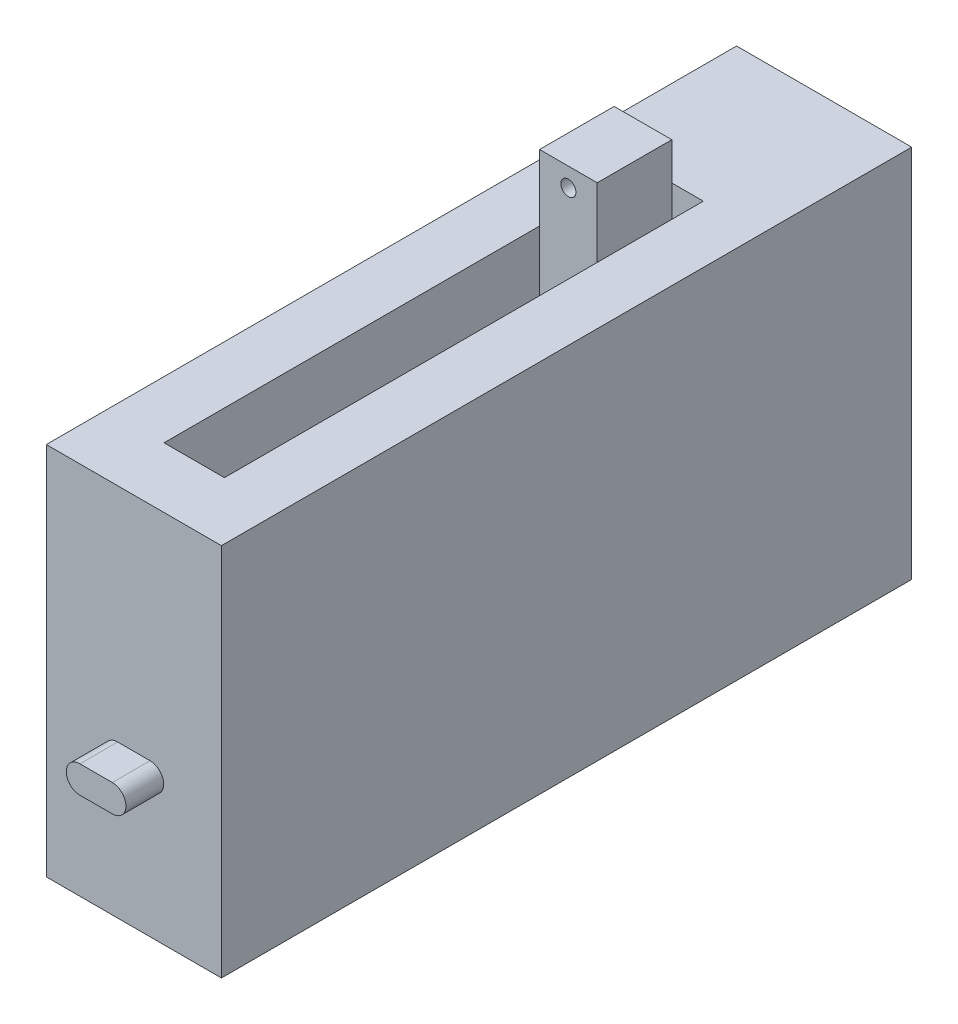
ISO-10303-21;
HEADER;
FILE_DESCRIPTION(('STEP AP214'),'2;1');
FILE_NAME('part.step','',(''),(''),'','','');
FILE_SCHEMA(('AUTOMOTIVE_DESIGN { 1 0 10303 214 1 1 1 1 }'));
ENDSEC;
DATA;
#1=APPLICATION_CONTEXT('core data for automotive mechanical design processes');
#2=APPLICATION_PROTOCOL_DEFINITION('international standard','automotive_design',2000,#1);
#3=PRODUCT_CONTEXT('',#1,'mechanical');
#4=PRODUCT('Part','Part','',(#3));
#5=PRODUCT_RELATED_PRODUCT_CATEGORY('part','',(#4));
#6=PRODUCT_DEFINITION_FORMATION('','',#4);
#7=PRODUCT_DEFINITION_CONTEXT('part definition',#1,'design');
#8=PRODUCT_DEFINITION('design','',#6,#7);
#9=PRODUCT_DEFINITION_SHAPE('','',#8);
#10=(LENGTH_UNIT() NAMED_UNIT(*) SI_UNIT(.MILLI.,.METRE.));
#11=(NAMED_UNIT(*) PLANE_ANGLE_UNIT() SI_UNIT($,.RADIAN.));
#12=(NAMED_UNIT(*) SI_UNIT($,.STERADIAN.) SOLID_ANGLE_UNIT());
#13=UNCERTAINTY_MEASURE_WITH_UNIT(LENGTH_MEASURE(1.E-05),#10,'distance_accuracy_value','');
#14=(GEOMETRIC_REPRESENTATION_CONTEXT(3) GLOBAL_UNCERTAINTY_ASSIGNED_CONTEXT((#13)) GLOBAL_UNIT_ASSIGNED_CONTEXT((#10,
#11,#12)) REPRESENTATION_CONTEXT('',''));
#15=CARTESIAN_POINT('',(0.,0.,0.));
#16=DIRECTION('',(0.,0.,1.));
#17=DIRECTION('',(1.,0.,0.));
#18=AXIS2_PLACEMENT_3D('',#15,#16,#17);
#19=CARTESIAN_POINT('',(-3.683,15.748,14.5161));
#20=DIRECTION('',(0.,0.,-1.));
#21=DIRECTION('',(-1.,0.,0.));
#22=AXIS2_PLACEMENT_3D('',#19,#20,#21);
#23=PLANE('',#22);
#24=DIRECTION('',(1.,0.,0.));
#25=VECTOR('',#24,1.);
#26=CARTESIAN_POINT('',(-3.683,0.,14.5161));
#27=LINE('',#26,#25);
#28=CARTESIAN_POINT('',(-3.683,0.,14.5161));
#29=VERTEX_POINT('',#28);
#30=CARTESIAN_POINT('',(3.683,0.,14.5161));
#31=VERTEX_POINT('',#30);
#32=EDGE_CURVE('E253',#29,#31,#27,.T.);
#33=ORIENTED_EDGE('',*,*,#32,.T.);
#34=DIRECTION('',(0.,-1.,0.));
#35=VECTOR('',#34,1.);
#36=CARTESIAN_POINT('',(3.683,15.748,14.5161));
#37=LINE('',#36,#35);
#38=CARTESIAN_POINT('',(3.683,15.748,14.5161));
#39=VERTEX_POINT('',#38);
#40=EDGE_CURVE('E259',#39,#31,#37,.T.);
#41=ORIENTED_EDGE('',*,*,#40,.F.);
#42=DIRECTION('',(1.,0.,0.));
#43=VECTOR('',#42,1.);
#44=CARTESIAN_POINT('',(-3.683,15.748,14.5161));
#45=LINE('',#44,#43);
#46=CARTESIAN_POINT('',(-3.683,15.748,14.5161));
#47=VERTEX_POINT('',#46);
#48=EDGE_CURVE('E257',#47,#39,#45,.T.);
#49=ORIENTED_EDGE('',*,*,#48,.F.);
#50=DIRECTION('',(0.,-1.,0.));
#51=VECTOR('',#50,1.);
#52=CARTESIAN_POINT('',(-3.683,15.748,14.5161));
#53=LINE('',#52,#51);
#54=EDGE_CURVE('E269',#47,#29,#53,.T.);
#55=ORIENTED_EDGE('',*,*,#54,.T.);
#56=EDGE_LOOP('',(#33,#41,#49,#55));
#57=FACE_BOUND('',#56,.T.);
#58=CARTESIAN_POINT('',(-0.682666256929174,5.842,14.5161));
#59=DIRECTION('',(0.,0.,1.));
#60=DIRECTION('',(1.,0.,0.));
#61=AXIS2_PLACEMENT_3D('',#58,#59,#60);
#62=CIRCLE('',#61,0.572003725186661);
#63=CARTESIAN_POINT('',(-0.682666256929174,6.41400372518666,14.5161));
#64=VERTEX_POINT('',#63);
#65=CARTESIAN_POINT('',(-0.682666256929174,5.26999627481334,14.5161));
#66=VERTEX_POINT('',#65);
#67=EDGE_CURVE('E171',#64,#66,#62,.T.);
#68=ORIENTED_EDGE('',*,*,#67,.F.);
#69=DIRECTION('',(-1.,0.,0.));
#70=VECTOR('',#69,1.);
#71=CARTESIAN_POINT('',(-0.682666256929174,6.41400372518666,14.5161));
#72=LINE('',#71,#70);
#73=CARTESIAN_POINT('',(0.682666256929174,6.41400372518666,14.5161));
#74=VERTEX_POINT('',#73);
#75=EDGE_CURVE('E168',#74,#64,#72,.T.);
#76=ORIENTED_EDGE('',*,*,#75,.F.);
#77=CARTESIAN_POINT('',(0.682666256929174,5.842,14.5161));
#78=DIRECTION('',(0.,0.,1.));
#79=DIRECTION('',(1.,0.,0.));
#80=AXIS2_PLACEMENT_3D('',#77,#78,#79);
#81=CIRCLE('',#80,0.572003725186661);
#82=CARTESIAN_POINT('',(0.682666256929174,5.26999627481334,14.5161));
#83=VERTEX_POINT('',#82);
#84=EDGE_CURVE('E58',#83,#74,#81,.T.);
#85=ORIENTED_EDGE('',*,*,#84,.F.);
#86=DIRECTION('',(1.,0.,0.));
#87=VECTOR('',#86,1.);
#88=CARTESIAN_POINT('',(-0.682666256929174,5.26999627481334,14.5161));
#89=LINE('',#88,#87);
#90=EDGE_CURVE('E53',#66,#83,#89,.T.);
#91=ORIENTED_EDGE('',*,*,#90,.F.);
#92=EDGE_LOOP('',(#68,#76,#85,#91));
#93=FACE_BOUND('',#92,.T.);
#94=ADVANCED_FACE('F37',(#57,#93),#23,.F.);
#95=CARTESIAN_POINT('',(0.,12.573,0.));
#96=DIRECTION('',(0.,-1.,0.));
#97=DIRECTION('',(0.,0.,-1.));
#98=AXIS2_PLACEMENT_3D('',#95,#96,#97);
#99=PLANE('',#98);
#100=DIRECTION('',(0.,0.,-1.));
#101=VECTOR('',#100,1.);
#102=CARTESIAN_POINT('',(1.27,12.573,11.9761));
#103=LINE('',#102,#101);
#104=CARTESIAN_POINT('',(1.27,12.573,11.9761));
#105=VERTEX_POINT('',#104);
#106=CARTESIAN_POINT('',(1.27,12.573,-8.1661));
#107=VERTEX_POINT('',#106);
#108=EDGE_CURVE('E217',#105,#107,#103,.T.);
#109=ORIENTED_EDGE('',*,*,#108,.T.);
#110=DIRECTION('',(-1.,0.,0.));
#111=VECTOR('',#110,1.);
#112=CARTESIAN_POINT('',(-1.27,12.573,-8.1661));
#113=LINE('',#112,#111);
#114=CARTESIAN_POINT('',(-1.27,12.573,-8.1661));
#115=VERTEX_POINT('',#114);
#116=EDGE_CURVE('E220',#107,#115,#113,.T.);
#117=ORIENTED_EDGE('',*,*,#116,.T.);
#118=DIRECTION('',(0.,0.,1.));
#119=VECTOR('',#118,1.);
#120=CARTESIAN_POINT('',(-1.27,12.573,11.9761));
#121=LINE('',#120,#119);
#122=CARTESIAN_POINT('',(-1.27,12.573,11.9761));
#123=VERTEX_POINT('',#122);
#124=EDGE_CURVE('E224',#115,#123,#121,.T.);
#125=ORIENTED_EDGE('',*,*,#124,.T.);
#126=DIRECTION('',(1.,0.,0.));
#127=VECTOR('',#126,1.);
#128=CARTESIAN_POINT('',(-1.27,12.573,11.9761));
#129=LINE('',#128,#127);
#130=EDGE_CURVE('E227',#123,#105,#129,.T.);
#131=ORIENTED_EDGE('',*,*,#130,.T.);
#132=EDGE_LOOP('',(#109,#117,#125,#131));
#133=FACE_BOUND('',#132,.T.);
#134=DIRECTION('',(-1.,0.,0.));
#135=VECTOR('',#134,1.);
#136=CARTESIAN_POINT('',(1.21285,12.573,-6.8961));
#137=LINE('',#136,#135);
#138=CARTESIAN_POINT('',(1.21285,12.573,-6.8961));
#139=VERTEX_POINT('',#138);
#140=CARTESIAN_POINT('',(-1.21285,12.573,-6.8961));
#141=VERTEX_POINT('',#140);
#142=EDGE_CURVE('E200',#139,#141,#137,.T.);
#143=ORIENTED_EDGE('',*,*,#142,.F.);
#144=DIRECTION('',(0.,0.,-1.));
#145=VECTOR('',#144,1.);
#146=CARTESIAN_POINT('',(1.21285,12.573,-6.8961));
#147=LINE('',#146,#145);
#148=CARTESIAN_POINT('',(1.21285,12.573,-3.7592));
#149=VERTEX_POINT('',#148);
#150=EDGE_CURVE('E197',#149,#139,#147,.T.);
#151=ORIENTED_EDGE('',*,*,#150,.F.);
#152=DIRECTION('',(1.,0.,0.));
#153=VECTOR('',#152,1.);
#154=CARTESIAN_POINT('',(1.21285,12.573,-3.7592));
#155=LINE('',#154,#153);
#156=CARTESIAN_POINT('',(-1.21285,12.573,-3.7592));
#157=VERTEX_POINT('',#156);
#158=EDGE_CURVE('E194',#157,#149,#155,.T.);
#159=ORIENTED_EDGE('',*,*,#158,.F.);
#160=DIRECTION('',(0.,0.,1.));
#161=VECTOR('',#160,1.);
#162=CARTESIAN_POINT('',(-1.21285,12.573,-6.8961));
#163=LINE('',#162,#161);
#164=EDGE_CURVE('E191',#141,#157,#163,.T.);
#165=ORIENTED_EDGE('',*,*,#164,.F.);
#166=EDGE_LOOP('',(#143,#151,#159,#165));
#167=FACE_BOUND('',#166,.T.);
#168=ADVANCED_FACE('F299',(#133,#167),#99,.F.);
#169=CARTESIAN_POINT('',(3.683,15.748,14.5161));
#170=DIRECTION('',(-1.,0.,0.));
#171=DIRECTION('',(0.,0.,1.));
#172=AXIS2_PLACEMENT_3D('',#169,#170,#171);
#173=PLANE('',#172);
#174=DIRECTION('',(0.,0.,-1.));
#175=VECTOR('',#174,1.);
#176=CARTESIAN_POINT('',(3.683,0.,14.5161));
#177=LINE('',#176,#175);
#178=CARTESIAN_POINT('',(3.683,0.,-14.5161));
#179=VERTEX_POINT('',#178);
#180=EDGE_CURVE('E242',#31,#179,#177,.T.);
#181=ORIENTED_EDGE('',*,*,#180,.T.);
#182=DIRECTION('',(0.,-1.,0.));
#183=VECTOR('',#182,1.);
#184=CARTESIAN_POINT('',(3.683,15.748,-14.5161));
#185=LINE('',#184,#183);
#186=CARTESIAN_POINT('',(3.683,15.748,-14.5161));
#187=VERTEX_POINT('',#186);
#188=EDGE_CURVE('E12',#187,#179,#185,.T.);
#189=ORIENTED_EDGE('',*,*,#188,.F.);
#190=DIRECTION('',(0.,0.,-1.));
#191=VECTOR('',#190,1.);
#192=CARTESIAN_POINT('',(3.683,15.748,14.5161));
#193=LINE('',#192,#191);
#194=EDGE_CURVE('E249',#39,#187,#193,.T.);
#195=ORIENTED_EDGE('',*,*,#194,.F.);
#196=ORIENTED_EDGE('',*,*,#40,.T.);
#197=EDGE_LOOP('',(#181,#189,#195,#196));
#198=FACE_BOUND('',#197,.T.);
#199=ADVANCED_FACE('F39',(#198),#173,.F.);
#200=CARTESIAN_POINT('',(-3.683,15.748,-14.5161));
#201=DIRECTION('',(0.,0.,1.));
#202=DIRECTION('',(1.,0.,0.));
#203=AXIS2_PLACEMENT_3D('',#200,#201,#202);
#204=PLANE('',#203);
#205=DIRECTION('',(-1.,0.,0.));
#206=VECTOR('',#205,1.);
#207=CARTESIAN_POINT('',(-3.683,0.,-14.5161));
#208=LINE('',#207,#206);
#209=CARTESIAN_POINT('',(-3.683,0.,-14.5161));
#210=VERTEX_POINT('',#209);
#211=EDGE_CURVE('E262',#179,#210,#208,.T.);
#212=ORIENTED_EDGE('',*,*,#211,.T.);
#213=DIRECTION('',(0.,-1.,0.));
#214=VECTOR('',#213,1.);
#215=CARTESIAN_POINT('',(-3.683,15.748,-14.5161));
#216=LINE('',#215,#214);
#217=CARTESIAN_POINT('',(-3.683,15.748,-14.5161));
#218=VERTEX_POINT('',#217);
#219=EDGE_CURVE('E46',#218,#210,#216,.T.);
#220=ORIENTED_EDGE('',*,*,#219,.F.);
#221=DIRECTION('',(-1.,0.,0.));
#222=VECTOR('',#221,1.);
#223=CARTESIAN_POINT('',(-3.683,15.748,-14.5161));
#224=LINE('',#223,#222);
#225=EDGE_CURVE('E252',#187,#218,#224,.T.);
#226=ORIENTED_EDGE('',*,*,#225,.F.);
#227=ORIENTED_EDGE('',*,*,#188,.T.);
#228=EDGE_LOOP('',(#212,#220,#226,#227));
#229=FACE_BOUND('',#228,.T.);
#230=ADVANCED_FACE('F292',(#229),#204,.F.);
#231=CARTESIAN_POINT('',(-3.683,15.748,14.5161));
#232=DIRECTION('',(1.,0.,0.));
#233=DIRECTION('',(0.,0.,-1.));
#234=AXIS2_PLACEMENT_3D('',#231,#232,#233);
#235=PLANE('',#234);
#236=DIRECTION('',(0.,0.,1.));
#237=VECTOR('',#236,1.);
#238=CARTESIAN_POINT('',(-3.683,0.,14.5161));
#239=LINE('',#238,#237);
#240=EDGE_CURVE('E264',#210,#29,#239,.T.);
#241=ORIENTED_EDGE('',*,*,#240,.T.);
#242=ORIENTED_EDGE('',*,*,#54,.F.);
#243=DIRECTION('',(0.,0.,1.));
#244=VECTOR('',#243,1.);
#245=CARTESIAN_POINT('',(-3.683,15.748,14.5161));
#246=LINE('',#245,#244);
#247=EDGE_CURVE('E255',#218,#47,#246,.T.);
#248=ORIENTED_EDGE('',*,*,#247,.F.);
#249=ORIENTED_EDGE('',*,*,#219,.T.);
#250=EDGE_LOOP('',(#241,#242,#248,#249));
#251=FACE_BOUND('',#250,.T.);
#252=ADVANCED_FACE('F277',(#251),#235,.F.);
#253=CARTESIAN_POINT('',(0.,15.748,0.));
#254=DIRECTION('',(0.,-1.,0.));
#255=DIRECTION('',(0.,0.,-1.));
#256=AXIS2_PLACEMENT_3D('',#253,#254,#255);
#257=PLANE('',#256);
#258=DIRECTION('',(-1.,0.,0.));
#259=VECTOR('',#258,1.);
#260=CARTESIAN_POINT('',(-1.27,15.748,-8.1661));
#261=LINE('',#260,#259);
#262=CARTESIAN_POINT('',(1.27,15.748,-8.1661));
#263=VERTEX_POINT('',#262);
#264=CARTESIAN_POINT('',(-1.27,15.748,-8.1661));
#265=VERTEX_POINT('',#264);
#266=EDGE_CURVE('E232',#263,#265,#261,.T.);
#267=ORIENTED_EDGE('',*,*,#266,.F.);
#268=DIRECTION('',(0.,0.,-1.));
#269=VECTOR('',#268,1.);
#270=CARTESIAN_POINT('',(1.27,15.748,11.9761));
#271=LINE('',#270,#269);
#272=CARTESIAN_POINT('',(1.27,15.748,11.9761));
#273=VERTEX_POINT('',#272);
#274=EDGE_CURVE('E190',#273,#263,#271,.T.);
#275=ORIENTED_EDGE('',*,*,#274,.F.);
#276=DIRECTION('',(1.,0.,0.));
#277=VECTOR('',#276,1.);
#278=CARTESIAN_POINT('',(-1.27,15.748,11.9761));
#279=LINE('',#278,#277);
#280=CARTESIAN_POINT('',(-1.27,15.748,11.9761));
#281=VERTEX_POINT('',#280);
#282=EDGE_CURVE('E221',#281,#273,#279,.T.);
#283=ORIENTED_EDGE('',*,*,#282,.F.);
#284=DIRECTION('',(0.,0.,1.));
#285=VECTOR('',#284,1.);
#286=CARTESIAN_POINT('',(-1.27,15.748,11.9761));
#287=LINE('',#286,#285);
#288=EDGE_CURVE('E235',#265,#281,#287,.T.);
#289=ORIENTED_EDGE('',*,*,#288,.F.);
#290=EDGE_LOOP('',(#267,#275,#283,#289));
#291=FACE_BOUND('',#290,.T.);
#292=ORIENTED_EDGE('',*,*,#194,.T.);
#293=ORIENTED_EDGE('',*,*,#225,.T.);
#294=ORIENTED_EDGE('',*,*,#247,.T.);
#295=ORIENTED_EDGE('',*,*,#48,.T.);
#296=EDGE_LOOP('',(#292,#293,#294,#295));
#297=FACE_BOUND('',#296,.T.);
#298=ADVANCED_FACE('F291',(#291,#297),#257,.F.);
#299=CARTESIAN_POINT('',(0.,0.,0.));
#300=DIRECTION('',(0.,-1.,0.));
#301=DIRECTION('',(0.,0.,-1.));
#302=AXIS2_PLACEMENT_3D('',#299,#300,#301);
#303=PLANE('',#302);
#304=ORIENTED_EDGE('',*,*,#180,.F.);
#305=ORIENTED_EDGE('',*,*,#32,.F.);
#306=ORIENTED_EDGE('',*,*,#240,.F.);
#307=ORIENTED_EDGE('',*,*,#211,.F.);
#308=EDGE_LOOP('',(#304,#305,#306,#307));
#309=FACE_BOUND('',#308,.T.);
#310=ADVANCED_FACE('F283',(#309),#303,.T.);
#311=CARTESIAN_POINT('',(1.27,12.573,11.9761));
#312=DIRECTION('',(1.,0.,0.));
#313=DIRECTION('',(0.,0.,-1.));
#314=AXIS2_PLACEMENT_3D('',#311,#312,#313);
#315=PLANE('',#314);
#316=ORIENTED_EDGE('',*,*,#274,.T.);
#317=DIRECTION('',(0.,1.,0.));
#318=VECTOR('',#317,1.);
#319=CARTESIAN_POINT('',(1.27,12.573,-8.1661));
#320=LINE('',#319,#318);
#321=EDGE_CURVE('E230',#107,#263,#320,.T.);
#322=ORIENTED_EDGE('',*,*,#321,.F.);
#323=ORIENTED_EDGE('',*,*,#108,.F.);
#324=DIRECTION('',(0.,1.,0.));
#325=VECTOR('',#324,1.);
#326=CARTESIAN_POINT('',(1.27,12.573,11.9761));
#327=LINE('',#326,#325);
#328=EDGE_CURVE('E240',#105,#273,#327,.T.);
#329=ORIENTED_EDGE('',*,*,#328,.T.);
#330=EDGE_LOOP('',(#316,#322,#323,#329));
#331=FACE_BOUND('',#330,.T.);
#332=ADVANCED_FACE('F310',(#331),#315,.F.);
#333=CARTESIAN_POINT('',(-1.27,12.573,11.9761));
#334=DIRECTION('',(0.,0.,1.));
#335=DIRECTION('',(1.,0.,0.));
#336=AXIS2_PLACEMENT_3D('',#333,#334,#335);
#337=PLANE('',#336);
#338=ORIENTED_EDGE('',*,*,#282,.T.);
#339=ORIENTED_EDGE('',*,*,#328,.F.);
#340=ORIENTED_EDGE('',*,*,#130,.F.);
#341=DIRECTION('',(0.,1.,0.));
#342=VECTOR('',#341,1.);
#343=CARTESIAN_POINT('',(-1.27,12.573,11.9761));
#344=LINE('',#343,#342);
#345=EDGE_CURVE('E243',#123,#281,#344,.T.);
#346=ORIENTED_EDGE('',*,*,#345,.T.);
#347=EDGE_LOOP('',(#338,#339,#340,#346));
#348=FACE_BOUND('',#347,.T.);
#349=ADVANCED_FACE('F316',(#348),#337,.F.);
#350=CARTESIAN_POINT('',(-1.27,12.573,11.9761));
#351=DIRECTION('',(-1.,0.,0.));
#352=DIRECTION('',(0.,0.,1.));
#353=AXIS2_PLACEMENT_3D('',#350,#351,#352);
#354=PLANE('',#353);
#355=ORIENTED_EDGE('',*,*,#288,.T.);
#356=ORIENTED_EDGE('',*,*,#345,.F.);
#357=ORIENTED_EDGE('',*,*,#124,.F.);
#358=DIRECTION('',(0.,1.,0.));
#359=VECTOR('',#358,1.);
#360=CARTESIAN_POINT('',(-1.27,12.573,-8.1661));
#361=LINE('',#360,#359);
#362=EDGE_CURVE('E245',#115,#265,#361,.T.);
#363=ORIENTED_EDGE('',*,*,#362,.T.);
#364=EDGE_LOOP('',(#355,#356,#357,#363));
#365=FACE_BOUND('',#364,.T.);
#366=ADVANCED_FACE('F322',(#365),#354,.F.);
#367=CARTESIAN_POINT('',(-1.27,12.573,-8.1661));
#368=DIRECTION('',(0.,0.,-1.));
#369=DIRECTION('',(-1.,0.,0.));
#370=AXIS2_PLACEMENT_3D('',#367,#368,#369);
#371=PLANE('',#370);
#372=ORIENTED_EDGE('',*,*,#266,.T.);
#373=ORIENTED_EDGE('',*,*,#362,.F.);
#374=ORIENTED_EDGE('',*,*,#116,.F.);
#375=ORIENTED_EDGE('',*,*,#321,.T.);
#376=EDGE_LOOP('',(#372,#373,#374,#375));
#377=FACE_BOUND('',#376,.T.);
#378=ADVANCED_FACE('F318',(#377),#371,.F.);
#379=CARTESIAN_POINT('',(1.21285,25.402970361013,-6.8961));
#380=DIRECTION('',(0.,0.,1.));
#381=DIRECTION('',(1.,0.,0.));
#382=AXIS2_PLACEMENT_3D('',#379,#380,#381);
#383=PLANE('',#382);
#384=CARTESIAN_POINT('',(0.,17.79905,-6.8961));
#385=DIRECTION('',(0.,0.,-1.));
#386=DIRECTION('',(-1.,0.,0.));
#387=AXIS2_PLACEMENT_3D('',#384,#385,#386);
#388=CIRCLE('',#387,0.317500000000001);
#389=CARTESIAN_POINT('',(-0.317500000000001,17.79905,-6.8961));
#390=VERTEX_POINT('',#389);
#391=EDGE_CURVE('E172',#390,#390,#388,.T.);
#392=ORIENTED_EDGE('',*,*,#391,.F.);
#393=EDGE_LOOP('',(#392));
#394=FACE_BOUND('',#393,.T.);
#395=DIRECTION('',(0.,-1.,0.));
#396=VECTOR('',#395,1.);
#397=CARTESIAN_POINT('',(-1.21285,25.402970361013,-6.8961));
#398=LINE('',#397,#396);
#399=CARTESIAN_POINT('',(-1.21285,18.5928,-6.8961));
#400=VERTEX_POINT('',#399);
#401=EDGE_CURVE('E203',#400,#141,#398,.T.);
#402=ORIENTED_EDGE('',*,*,#401,.F.);
#403=DIRECTION('',(1.,0.,0.));
#404=VECTOR('',#403,1.);
#405=CARTESIAN_POINT('',(1.21285,18.5928,-6.8961));
#406=LINE('',#405,#404);
#407=CARTESIAN_POINT('',(1.21285,18.5928,-6.8961));
#408=VERTEX_POINT('',#407);
#409=EDGE_CURVE('E184',#400,#408,#406,.T.);
#410=ORIENTED_EDGE('',*,*,#409,.T.);
#411=DIRECTION('',(0.,-1.,0.));
#412=VECTOR('',#411,1.);
#413=CARTESIAN_POINT('',(1.21285,25.402970361013,-6.8961));
#414=LINE('',#413,#412);
#415=EDGE_CURVE('E206',#408,#139,#414,.T.);
#416=ORIENTED_EDGE('',*,*,#415,.T.);
#417=ORIENTED_EDGE('',*,*,#142,.T.);
#418=EDGE_LOOP('',(#402,#410,#416,#417));
#419=FACE_BOUND('',#418,.T.);
#420=ADVANCED_FACE('F321',(#394,#419),#383,.F.);
#421=CARTESIAN_POINT('',(1.21285,25.402970361013,-6.8961));
#422=DIRECTION('',(-1.,0.,0.));
#423=DIRECTION('',(0.,0.,1.));
#424=AXIS2_PLACEMENT_3D('',#421,#422,#423);
#425=PLANE('',#424);
#426=ORIENTED_EDGE('',*,*,#415,.F.);
#427=DIRECTION('',(0.,0.,1.));
#428=VECTOR('',#427,1.);
#429=CARTESIAN_POINT('',(1.21285,18.5928,-6.8961));
#430=LINE('',#429,#428);
#431=CARTESIAN_POINT('',(1.21285,18.5928,-3.7592));
#432=VERTEX_POINT('',#431);
#433=EDGE_CURVE('E180',#408,#432,#430,.T.);
#434=ORIENTED_EDGE('',*,*,#433,.T.);
#435=DIRECTION('',(0.,-1.,0.));
#436=VECTOR('',#435,1.);
#437=CARTESIAN_POINT('',(1.21285,25.402970361013,-3.7592));
#438=LINE('',#437,#436);
#439=EDGE_CURVE('E209',#432,#149,#438,.T.);
#440=ORIENTED_EDGE('',*,*,#439,.T.);
#441=ORIENTED_EDGE('',*,*,#150,.T.);
#442=EDGE_LOOP('',(#426,#434,#440,#441));
#443=FACE_BOUND('',#442,.T.);
#444=ADVANCED_FACE('F338',(#443),#425,.F.);
#445=CARTESIAN_POINT('',(1.21285,25.402970361013,-3.7592));
#446=DIRECTION('',(0.,0.,-1.));
#447=DIRECTION('',(-1.,0.,0.));
#448=AXIS2_PLACEMENT_3D('',#445,#446,#447);
#449=PLANE('',#448);
#450=CARTESIAN_POINT('',(0.,17.79905,-3.7592));
#451=DIRECTION('',(0.,0.,-1.));
#452=DIRECTION('',(-1.,0.,0.));
#453=AXIS2_PLACEMENT_3D('',#450,#451,#452);
#454=CIRCLE('',#453,0.317500000000001);
#455=CARTESIAN_POINT('',(-0.3175,17.79905,-3.7592));
#456=VERTEX_POINT('',#455);
#457=EDGE_CURVE('E41',#456,#456,#454,.T.);
#458=ORIENTED_EDGE('',*,*,#457,.T.);
#459=EDGE_LOOP('',(#458));
#460=FACE_BOUND('',#459,.T.);
#461=ORIENTED_EDGE('',*,*,#439,.F.);
#462=DIRECTION('',(-1.,0.,0.));
#463=VECTOR('',#462,1.);
#464=CARTESIAN_POINT('',(1.21285,18.5928,-3.7592));
#465=LINE('',#464,#463);
#466=CARTESIAN_POINT('',(-1.21285,18.5928,-3.7592));
#467=VERTEX_POINT('',#466);
#468=EDGE_CURVE('E183',#432,#467,#465,.T.);
#469=ORIENTED_EDGE('',*,*,#468,.T.);
#470=DIRECTION('',(0.,-1.,0.));
#471=VECTOR('',#470,1.);
#472=CARTESIAN_POINT('',(-1.21285,25.402970361013,-3.7592));
#473=LINE('',#472,#471);
#474=EDGE_CURVE('E212',#467,#157,#473,.T.);
#475=ORIENTED_EDGE('',*,*,#474,.T.);
#476=ORIENTED_EDGE('',*,*,#158,.T.);
#477=EDGE_LOOP('',(#461,#469,#475,#476));
#478=FACE_BOUND('',#477,.T.);
#479=ADVANCED_FACE('F334',(#460,#478),#449,.F.);
#480=CARTESIAN_POINT('',(-1.21285,25.402970361013,-6.8961));
#481=DIRECTION('',(1.,0.,0.));
#482=DIRECTION('',(0.,0.,-1.));
#483=AXIS2_PLACEMENT_3D('',#480,#481,#482);
#484=PLANE('',#483);
#485=ORIENTED_EDGE('',*,*,#474,.F.);
#486=DIRECTION('',(0.,0.,-1.));
#487=VECTOR('',#486,1.);
#488=CARTESIAN_POINT('',(-1.21285,18.5928,-6.8961));
#489=LINE('',#488,#487);
#490=EDGE_CURVE('E187',#467,#400,#489,.T.);
#491=ORIENTED_EDGE('',*,*,#490,.T.);
#492=ORIENTED_EDGE('',*,*,#401,.T.);
#493=ORIENTED_EDGE('',*,*,#164,.T.);
#494=EDGE_LOOP('',(#485,#491,#492,#493));
#495=FACE_BOUND('',#494,.T.);
#496=ADVANCED_FACE('F330',(#495),#484,.F.);
#497=CARTESIAN_POINT('',(0.,18.5928,0.));
#498=DIRECTION('',(0.,-1.,0.));
#499=DIRECTION('',(0.,0.,-1.));
#500=AXIS2_PLACEMENT_3D('',#497,#498,#499);
#501=PLANE('',#500);
#502=ORIENTED_EDGE('',*,*,#468,.F.);
#503=ORIENTED_EDGE('',*,*,#433,.F.);
#504=ORIENTED_EDGE('',*,*,#409,.F.);
#505=ORIENTED_EDGE('',*,*,#490,.F.);
#506=EDGE_LOOP('',(#502,#503,#504,#505));
#507=FACE_BOUND('',#506,.T.);
#508=ADVANCED_FACE('F333',(#507),#501,.F.);
#509=CARTESIAN_POINT('',(0.,17.79905,14.5161));
#510=DIRECTION('',(0.,0.,-1.));
#511=DIRECTION('',(-1.,0.,0.));
#512=AXIS2_PLACEMENT_3D('',#509,#510,#511);
#513=CYLINDRICAL_SURFACE('',#512,0.317500000000001);
#514=ORIENTED_EDGE('',*,*,#391,.T.);
#515=EDGE_LOOP('',(#514));
#516=FACE_BOUND('',#515,.T.);
#517=ORIENTED_EDGE('',*,*,#457,.F.);
#518=EDGE_LOOP('',(#517));
#519=FACE_BOUND('',#518,.T.);
#520=ADVANCED_FACE('F348',(#516,#519),#513,.F.);
#521=CARTESIAN_POINT('',(-0.682666256929174,5.842,16.1036));
#522=DIRECTION('',(0.,0.,-1.));
#523=DIRECTION('',(-1.,0.,0.));
#524=AXIS2_PLACEMENT_3D('',#521,#522,#523);
#525=CYLINDRICAL_SURFACE('',#524,0.572003725186661);
#526=ORIENTED_EDGE('',*,*,#67,.T.);
#527=DIRECTION('',(0.,0.,-1.));
#528=VECTOR('',#527,1.);
#529=CARTESIAN_POINT('',(-0.682666256929174,5.26999627481334,16.1036));
#530=LINE('',#529,#528);
#531=CARTESIAN_POINT('',(-0.682666256929174,5.26999627481334,16.1036));
#532=VERTEX_POINT('',#531);
#533=EDGE_CURVE('E152',#532,#66,#530,.T.);
#534=ORIENTED_EDGE('',*,*,#533,.F.);
#535=CARTESIAN_POINT('',(-0.682666256929174,5.842,16.1036));
#536=DIRECTION('',(0.,0.,1.));
#537=DIRECTION('',(1.,0.,0.));
#538=AXIS2_PLACEMENT_3D('',#535,#536,#537);
#539=CIRCLE('',#538,0.572003725186661);
#540=CARTESIAN_POINT('',(-0.682666256929174,6.41400372518666,16.1036));
#541=VERTEX_POINT('',#540);
#542=EDGE_CURVE('E159',#541,#532,#539,.T.);
#543=ORIENTED_EDGE('',*,*,#542,.F.);
#544=DIRECTION('',(0.,0.,-1.));
#545=VECTOR('',#544,1.);
#546=CARTESIAN_POINT('',(-0.682666256929174,6.41400372518666,16.1036));
#547=LINE('',#546,#545);
#548=EDGE_CURVE('E506',#541,#64,#547,.T.);
#549=ORIENTED_EDGE('',*,*,#548,.T.);
#550=EDGE_LOOP('',(#526,#534,#543,#549));
#551=FACE_BOUND('',#550,.T.);
#552=ADVANCED_FACE('F170',(#551),#525,.T.);
#553=CARTESIAN_POINT('',(-0.682666256929174,5.26999627481334,16.1036));
#554=DIRECTION('',(0.,1.,0.));
#555=DIRECTION('',(0.,0.,1.));
#556=AXIS2_PLACEMENT_3D('',#553,#554,#555);
#557=PLANE('',#556);
#558=ORIENTED_EDGE('',*,*,#90,.T.);
#559=DIRECTION('',(0.,0.,-1.));
#560=VECTOR('',#559,1.);
#561=CARTESIAN_POINT('',(0.682666256929174,5.26999627481334,16.1036));
#562=LINE('',#561,#560);
#563=CARTESIAN_POINT('',(0.682666256929174,5.26999627481334,16.1036));
#564=VERTEX_POINT('',#563);
#565=EDGE_CURVE('E155',#564,#83,#562,.T.);
#566=ORIENTED_EDGE('',*,*,#565,.F.);
#567=DIRECTION('',(1.,0.,0.));
#568=VECTOR('',#567,1.);
#569=CARTESIAN_POINT('',(-0.682666256929174,5.26999627481334,16.1036));
#570=LINE('',#569,#568);
#571=EDGE_CURVE('E148',#532,#564,#570,.T.);
#572=ORIENTED_EDGE('',*,*,#571,.F.);
#573=ORIENTED_EDGE('',*,*,#533,.T.);
#574=EDGE_LOOP('',(#558,#566,#572,#573));
#575=FACE_BOUND('',#574,.T.);
#576=ADVANCED_FACE('F150',(#575),#557,.F.);
#577=CARTESIAN_POINT('',(0.682666256929174,5.842,16.1036));
#578=DIRECTION('',(0.,0.,-1.));
#579=DIRECTION('',(-1.,0.,0.));
#580=AXIS2_PLACEMENT_3D('',#577,#578,#579);
#581=CYLINDRICAL_SURFACE('',#580,0.572003725186661);
#582=ORIENTED_EDGE('',*,*,#84,.T.);
#583=DIRECTION('',(0.,0.,-1.));
#584=VECTOR('',#583,1.);
#585=CARTESIAN_POINT('',(0.682666256929174,6.41400372518666,16.1036));
#586=LINE('',#585,#584);
#587=CARTESIAN_POINT('',(0.682666256929174,6.41400372518666,16.1036));
#588=VERTEX_POINT('',#587);
#589=EDGE_CURVE('E176',#588,#74,#586,.T.);
#590=ORIENTED_EDGE('',*,*,#589,.F.);
#591=CARTESIAN_POINT('',(0.682666256929174,5.842,16.1036));
#592=DIRECTION('',(0.,0.,1.));
#593=DIRECTION('',(1.,0.,0.));
#594=AXIS2_PLACEMENT_3D('',#591,#592,#593);
#595=CIRCLE('',#594,0.572003725186661);
#596=EDGE_CURVE('E158',#564,#588,#595,.T.);
#597=ORIENTED_EDGE('',*,*,#596,.F.);
#598=ORIENTED_EDGE('',*,*,#565,.T.);
#599=EDGE_LOOP('',(#582,#590,#597,#598));
#600=FACE_BOUND('',#599,.T.);
#601=ADVANCED_FACE('F357',(#600),#581,.T.);
#602=CARTESIAN_POINT('',(-0.682666256929174,6.41400372518666,16.1036));
#603=DIRECTION('',(0.,-1.,0.));
#604=DIRECTION('',(0.,0.,-1.));
#605=AXIS2_PLACEMENT_3D('',#602,#603,#604);
#606=PLANE('',#605);
#607=ORIENTED_EDGE('',*,*,#75,.T.);
#608=ORIENTED_EDGE('',*,*,#548,.F.);
#609=DIRECTION('',(-1.,0.,0.));
#610=VECTOR('',#609,1.);
#611=CARTESIAN_POINT('',(-0.682666256929174,6.41400372518666,16.1036));
#612=LINE('',#611,#610);
#613=EDGE_CURVE('E164',#588,#541,#612,.T.);
#614=ORIENTED_EDGE('',*,*,#613,.F.);
#615=ORIENTED_EDGE('',*,*,#589,.T.);
#616=EDGE_LOOP('',(#607,#608,#614,#615));
#617=FACE_BOUND('',#616,.T.);
#618=ADVANCED_FACE('F360',(#617),#606,.F.);
#619=CARTESIAN_POINT('',(-0.682666256929174,5.842,16.1036));
#620=DIRECTION('',(0.,0.,1.));
#621=DIRECTION('',(1.,0.,0.));
#622=AXIS2_PLACEMENT_3D('',#619,#620,#621);
#623=PLANE('',#622);
#624=ORIENTED_EDGE('',*,*,#542,.T.);
#625=ORIENTED_EDGE('',*,*,#571,.T.);
#626=ORIENTED_EDGE('',*,*,#596,.T.);
#627=ORIENTED_EDGE('',*,*,#613,.T.);
#628=EDGE_LOOP('',(#624,#625,#626,#627));
#629=FACE_BOUND('',#628,.T.);
#630=ADVANCED_FACE('F162',(#629),#623,.T.);
#631=CLOSED_SHELL('',(#94,#168,#199,#230,#252,#298,#310,#332,#349,#366,#378,#420,#444,#479,#496,
#508,#520,#552,#576,#601,#618,#630));
#632=MANIFOLD_SOLID_BREP('B2',#631);
#633=ADVANCED_BREP_SHAPE_REPRESENTATION('',(#18,#632),#14);
#634=SHAPE_DEFINITION_REPRESENTATION(#9,#633);
ENDSEC;
END-ISO-10303-21;
